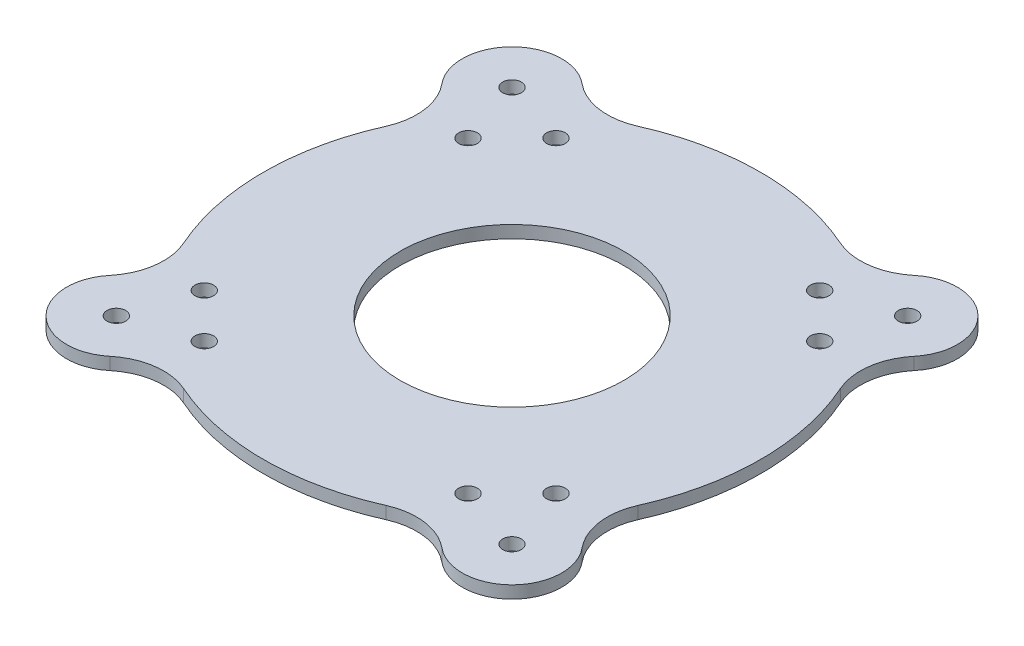
ISO-10303-21;
HEADER;
FILE_DESCRIPTION(('STEP AP214'),'2;1');
FILE_NAME('part.step','',(''),(''),'','','');
FILE_SCHEMA(('AUTOMOTIVE_DESIGN { 1 0 10303 214 1 1 1 1 }'));
ENDSEC;
DATA;
#1=APPLICATION_CONTEXT('core data for automotive mechanical design processes');
#2=APPLICATION_PROTOCOL_DEFINITION('international standard','automotive_design',2000,#1);
#3=PRODUCT_CONTEXT('',#1,'mechanical');
#4=PRODUCT('Part','Part','',(#3));
#5=PRODUCT_RELATED_PRODUCT_CATEGORY('part','',(#4));
#6=PRODUCT_DEFINITION_FORMATION('','',#4);
#7=PRODUCT_DEFINITION_CONTEXT('part definition',#1,'design');
#8=PRODUCT_DEFINITION('design','',#6,#7);
#9=PRODUCT_DEFINITION_SHAPE('','',#8);
#10=(LENGTH_UNIT() NAMED_UNIT(*) SI_UNIT(.MILLI.,.METRE.));
#11=(NAMED_UNIT(*) PLANE_ANGLE_UNIT() SI_UNIT($,.RADIAN.));
#12=(NAMED_UNIT(*) SI_UNIT($,.STERADIAN.) SOLID_ANGLE_UNIT());
#13=UNCERTAINTY_MEASURE_WITH_UNIT(LENGTH_MEASURE(1.E-05),#10,'distance_accuracy_value','');
#14=(GEOMETRIC_REPRESENTATION_CONTEXT(3) GLOBAL_UNCERTAINTY_ASSIGNED_CONTEXT((#13)) GLOBAL_UNIT_ASSIGNED_CONTEXT((#10,
#11,#12)) REPRESENTATION_CONTEXT('',''));
#15=CARTESIAN_POINT('',(0.,0.,0.));
#16=DIRECTION('',(0.,0.,1.));
#17=DIRECTION('',(1.,0.,0.));
#18=AXIS2_PLACEMENT_3D('',#15,#16,#17);
#19=CARTESIAN_POINT('',(0.,2.,0.));
#20=DIRECTION('',(0.,-1.,0.));
#21=DIRECTION('',(0.,0.,-1.));
#22=AXIS2_PLACEMENT_3D('',#19,#20,#21);
#23=CYLINDRICAL_SURFACE('',#22,40.);
#24=CARTESIAN_POINT('',(0.,2.,0.));
#25=DIRECTION('',(0.,1.,0.));
#26=DIRECTION('',(0.,0.,1.));
#27=AXIS2_PLACEMENT_3D('',#24,#25,#26);
#28=CIRCLE('',#27,40.);
#29=CARTESIAN_POINT('',(-36.5429472259402,2.,-16.2669298898764));
#30=VERTEX_POINT('',#29);
#31=CARTESIAN_POINT('',(-36.5429472259399,2.,16.2669298898769));
#32=VERTEX_POINT('',#31);
#33=EDGE_CURVE('E584',#30,#32,#28,.T.);
#34=ORIENTED_EDGE('',*,*,#33,.F.);
#35=DIRECTION('',(0.,-1.,0.));
#36=VECTOR('',#35,1.);
#37=CARTESIAN_POINT('',(-36.5429472259402,2.,-16.2669298898764));
#38=LINE('',#37,#36);
#39=CARTESIAN_POINT('',(-36.5429472259402,0.,-16.2669298898764));
#40=VERTEX_POINT('',#39);
#41=EDGE_CURVE('E189',#30,#40,#38,.T.);
#42=ORIENTED_EDGE('',*,*,#41,.T.);
#43=CARTESIAN_POINT('',(0.,0.,0.));
#44=DIRECTION('',(0.,1.,0.));
#45=DIRECTION('',(0.,0.,1.));
#46=AXIS2_PLACEMENT_3D('',#43,#44,#45);
#47=CIRCLE('',#46,40.);
#48=CARTESIAN_POINT('',(-36.5429472259399,0.,16.2669298898769));
#49=VERTEX_POINT('',#48);
#50=EDGE_CURVE('E172',#40,#49,#47,.T.);
#51=ORIENTED_EDGE('',*,*,#50,.T.);
#52=DIRECTION('',(0.,-1.,0.));
#53=VECTOR('',#52,1.);
#54=CARTESIAN_POINT('',(-36.5429472259399,2.,16.2669298898769));
#55=LINE('',#54,#53);
#56=EDGE_CURVE('E186',#49,#32,#55,.F.);
#57=ORIENTED_EDGE('',*,*,#56,.T.);
#58=EDGE_LOOP('',(#34,#42,#51,#57));
#59=FACE_BOUND('',#58,.T.);
#60=ADVANCED_FACE('F34',(#59),#23,.T.);
#61=CARTESIAN_POINT('',(16.2669298898766,0.,-36.5429472259401));
#62=VERTEX_POINT('',#61);
#63=CARTESIAN_POINT('',(-16.2669298898768,0.,-36.54294722594));
#64=VERTEX_POINT('',#63);
#65=EDGE_CURVE('E158',#62,#64,#47,.T.);
#66=ORIENTED_EDGE('',*,*,#65,.T.);
#67=DIRECTION('',(0.,-1.,0.));
#68=VECTOR('',#67,1.);
#69=CARTESIAN_POINT('',(-16.2669298898768,2.,-36.54294722594));
#70=LINE('',#69,#68);
#71=CARTESIAN_POINT('',(-16.2669298898768,2.,-36.54294722594));
#72=VERTEX_POINT('',#71);
#73=EDGE_CURVE('E162',#64,#72,#70,.F.);
#74=ORIENTED_EDGE('',*,*,#73,.T.);
#75=CARTESIAN_POINT('',(16.2669298898766,2.,-36.5429472259401));
#76=VERTEX_POINT('',#75);
#77=EDGE_CURVE('E161',#76,#72,#28,.T.);
#78=ORIENTED_EDGE('',*,*,#77,.F.);
#79=DIRECTION('',(0.,-1.,0.));
#80=VECTOR('',#79,1.);
#81=CARTESIAN_POINT('',(16.2669298898766,2.,-36.5429472259401));
#82=LINE('',#81,#80);
#83=EDGE_CURVE('E148',#76,#62,#82,.T.);
#84=ORIENTED_EDGE('',*,*,#83,.T.);
#85=EDGE_LOOP('',(#66,#74,#78,#84));
#86=FACE_BOUND('',#85,.T.);
#87=ADVANCED_FACE('F156',(#86),#23,.T.);
#88=CARTESIAN_POINT('',(36.54294722594,2.,16.2669298898767));
#89=VERTEX_POINT('',#88);
#90=CARTESIAN_POINT('',(36.54294722594,2.,-16.2669298898767));
#91=VERTEX_POINT('',#90);
#92=EDGE_CURVE('E163',#89,#91,#28,.T.);
#93=ORIENTED_EDGE('',*,*,#92,.F.);
#94=DIRECTION('',(0.,-1.,0.));
#95=VECTOR('',#94,1.);
#96=CARTESIAN_POINT('',(36.54294722594,2.,16.2669298898767));
#97=LINE('',#96,#95);
#98=CARTESIAN_POINT('',(36.54294722594,0.,16.2669298898767));
#99=VERTEX_POINT('',#98);
#100=EDGE_CURVE('E209',#89,#99,#97,.T.);
#101=ORIENTED_EDGE('',*,*,#100,.T.);
#102=CARTESIAN_POINT('',(36.54294722594,0.,-16.2669298898767));
#103=VERTEX_POINT('',#102);
#104=EDGE_CURVE('E171',#99,#103,#47,.T.);
#105=ORIENTED_EDGE('',*,*,#104,.T.);
#106=DIRECTION('',(0.,-1.,0.));
#107=VECTOR('',#106,1.);
#108=CARTESIAN_POINT('',(36.54294722594,2.,-16.2669298898767));
#109=LINE('',#108,#107);
#110=EDGE_CURVE('E206',#103,#91,#109,.F.);
#111=ORIENTED_EDGE('',*,*,#110,.T.);
#112=EDGE_LOOP('',(#93,#101,#105,#111));
#113=FACE_BOUND('',#112,.T.);
#114=ADVANCED_FACE('F247',(#113),#23,.T.);
#115=CARTESIAN_POINT('',(0.,2.,0.));
#116=DIRECTION('',(0.,1.,0.));
#117=DIRECTION('',(0.,0.,1.));
#118=AXIS2_PLACEMENT_3D('',#115,#116,#117);
#119=PLANE('',#118);
#120=CARTESIAN_POINT('',(31.8198051533948,2.,-31.8198051533945));
#121=DIRECTION('',(0.,1.,0.));
#122=DIRECTION('',(0.,0.,1.));
#123=AXIS2_PLACEMENT_3D('',#120,#121,#122);
#124=CIRCLE('',#123,1.5);
#125=CARTESIAN_POINT('',(31.8198051533948,2.,-30.3198051533945));
#126=VERTEX_POINT('',#125);
#127=EDGE_CURVE('E531',#126,#126,#124,.T.);
#128=ORIENTED_EDGE('',*,*,#127,.F.);
#129=EDGE_LOOP('',(#128));
#130=FACE_BOUND('',#129,.T.);
#131=CARTESIAN_POINT('',(-28.2842712474618,2.,21.2132034355965));
#132=DIRECTION('',(0.,1.,0.));
#133=DIRECTION('',(0.,0.,-1.));
#134=AXIS2_PLACEMENT_3D('',#131,#132,#133);
#135=CIRCLE('',#134,1.5);
#136=CARTESIAN_POINT('',(-28.2842712474618,2.,19.7132034355965));
#137=VERTEX_POINT('',#136);
#138=EDGE_CURVE('E537',#137,#137,#135,.T.);
#139=ORIENTED_EDGE('',*,*,#138,.F.);
#140=EDGE_LOOP('',(#139));
#141=FACE_BOUND('',#140,.T.);
#142=CARTESIAN_POINT('',(21.2132034355965,2.,-28.2842712474618));
#143=DIRECTION('',(0.,1.,0.));
#144=DIRECTION('',(0.,0.,1.));
#145=AXIS2_PLACEMENT_3D('',#142,#143,#144);
#146=CIRCLE('',#145,1.50000000000001);
#147=CARTESIAN_POINT('',(21.2132034355965,2.,-26.7842712474617));
#148=VERTEX_POINT('',#147);
#149=EDGE_CURVE('E639',#148,#148,#146,.T.);
#150=ORIENTED_EDGE('',*,*,#149,.F.);
#151=EDGE_LOOP('',(#150));
#152=FACE_BOUND('',#151,.T.);
#153=CARTESIAN_POINT('',(28.284271247462,2.,-21.2132034355962));
#154=DIRECTION('',(0.,1.,0.));
#155=DIRECTION('',(0.,0.,-1.));
#156=AXIS2_PLACEMENT_3D('',#153,#154,#155);
#157=CIRCLE('',#156,1.5);
#158=CARTESIAN_POINT('',(28.284271247462,2.,-22.7132034355963));
#159=VERTEX_POINT('',#158);
#160=EDGE_CURVE('E644',#159,#159,#157,.T.);
#161=ORIENTED_EDGE('',*,*,#160,.F.);
#162=EDGE_LOOP('',(#161));
#163=FACE_BOUND('',#162,.T.);
#164=CARTESIAN_POINT('',(-21.2132034355963,2.,28.2842712474619));
#165=DIRECTION('',(0.,1.,0.));
#166=DIRECTION('',(0.,0.,1.));
#167=AXIS2_PLACEMENT_3D('',#164,#165,#166);
#168=CIRCLE('',#167,1.50000000000001);
#169=CARTESIAN_POINT('',(-21.2132034355963,2.,29.7842712474619));
#170=VERTEX_POINT('',#169);
#171=EDGE_CURVE('E560',#170,#170,#168,.T.);
#172=ORIENTED_EDGE('',*,*,#171,.F.);
#173=EDGE_LOOP('',(#172));
#174=FACE_BOUND('',#173,.T.);
#175=CARTESIAN_POINT('',(-31.8198051533946,2.,-31.8198051533947));
#176=DIRECTION('',(0.,1.,0.));
#177=DIRECTION('',(0.,0.,1.));
#178=AXIS2_PLACEMENT_3D('',#175,#176,#177);
#179=CIRCLE('',#178,1.5);
#180=CARTESIAN_POINT('',(-31.8198051533946,2.,-30.3198051533947));
#181=VERTEX_POINT('',#180);
#182=EDGE_CURVE('E547',#181,#181,#179,.T.);
#183=ORIENTED_EDGE('',*,*,#182,.F.);
#184=EDGE_LOOP('',(#183));
#185=FACE_BOUND('',#184,.T.);
#186=CARTESIAN_POINT('',(-28.2842712474618,2.,-21.2132034355964));
#187=DIRECTION('',(0.,1.,0.));
#188=DIRECTION('',(0.,0.,1.));
#189=AXIS2_PLACEMENT_3D('',#186,#187,#188);
#190=CIRCLE('',#189,1.50000000000001);
#191=CARTESIAN_POINT('',(-28.2842712474618,2.,-19.7132034355964));
#192=VERTEX_POINT('',#191);
#193=EDGE_CURVE('E548',#192,#192,#190,.T.);
#194=ORIENTED_EDGE('',*,*,#193,.F.);
#195=EDGE_LOOP('',(#194));
#196=FACE_BOUND('',#195,.T.);
#197=CARTESIAN_POINT('',(-21.2132034355964,2.,-28.2842712474619));
#198=DIRECTION('',(0.,1.,0.));
#199=DIRECTION('',(0.,0.,-1.));
#200=AXIS2_PLACEMENT_3D('',#197,#198,#199);
#201=CIRCLE('',#200,1.5);
#202=CARTESIAN_POINT('',(-21.2132034355964,2.,-29.7842712474619));
#203=VERTEX_POINT('',#202);
#204=EDGE_CURVE('E534',#203,#203,#201,.T.);
#205=ORIENTED_EDGE('',*,*,#204,.F.);
#206=EDGE_LOOP('',(#205));
#207=FACE_BOUND('',#206,.T.);
#208=CARTESIAN_POINT('',(31.8198051533944,2.,31.8198051533949));
#209=DIRECTION('',(0.,1.,0.));
#210=DIRECTION('',(0.,0.,1.));
#211=AXIS2_PLACEMENT_3D('',#208,#209,#210);
#212=CIRCLE('',#211,1.5);
#213=CARTESIAN_POINT('',(31.8198051533944,2.,33.3198051533949));
#214=VERTEX_POINT('',#213);
#215=EDGE_CURVE('E622',#214,#214,#212,.T.);
#216=ORIENTED_EDGE('',*,*,#215,.F.);
#217=EDGE_LOOP('',(#216));
#218=FACE_BOUND('',#217,.T.);
#219=CARTESIAN_POINT('',(28.2842712474617,2.,21.2132034355966));
#220=DIRECTION('',(0.,1.,0.));
#221=DIRECTION('',(0.,0.,1.));
#222=AXIS2_PLACEMENT_3D('',#219,#220,#221);
#223=CIRCLE('',#222,1.50000000000001);
#224=CARTESIAN_POINT('',(28.2842712474617,2.,22.7132034355967));
#225=VERTEX_POINT('',#224);
#226=EDGE_CURVE('E626',#225,#225,#223,.T.);
#227=ORIENTED_EDGE('',*,*,#226,.F.);
#228=EDGE_LOOP('',(#227));
#229=FACE_BOUND('',#228,.T.);
#230=CARTESIAN_POINT('',(21.2132034355962,2.,28.2842712474621));
#231=DIRECTION('',(0.,1.,0.));
#232=DIRECTION('',(0.,0.,-1.));
#233=AXIS2_PLACEMENT_3D('',#230,#231,#232);
#234=CIRCLE('',#233,1.5);
#235=CARTESIAN_POINT('',(21.2132034355962,2.,26.7842712474621));
#236=VERTEX_POINT('',#235);
#237=EDGE_CURVE('E629',#236,#236,#234,.T.);
#238=ORIENTED_EDGE('',*,*,#237,.F.);
#239=EDGE_LOOP('',(#238));
#240=FACE_BOUND('',#239,.T.);
#241=CARTESIAN_POINT('',(-31.8198051533946,2.,31.8198051533947));
#242=DIRECTION('',(0.,1.,0.));
#243=DIRECTION('',(0.,0.,1.));
#244=AXIS2_PLACEMENT_3D('',#241,#242,#243);
#245=CIRCLE('',#244,1.5);
#246=CARTESIAN_POINT('',(-31.8198051533946,2.,33.3198051533947));
#247=VERTEX_POINT('',#246);
#248=EDGE_CURVE('E559',#247,#247,#245,.T.);
#249=ORIENTED_EDGE('',*,*,#248,.F.);
#250=EDGE_LOOP('',(#249));
#251=FACE_BOUND('',#250,.T.);
#252=CARTESIAN_POINT('',(-31.8198051533948,2.,-31.8198051533945));
#253=DIRECTION('',(0.,-1.,0.));
#254=DIRECTION('',(0.,0.,-1.));
#255=AXIS2_PLACEMENT_3D('',#252,#253,#254);
#256=CIRCLE('',#255,7.99999999999999);
#257=CARTESIAN_POINT('',(-37.9793068774083,2.,-26.7148528018172));
#258=VERTEX_POINT('',#257);
#259=CARTESIAN_POINT('',(-26.7148528018176,2.,-37.979306877408));
#260=VERTEX_POINT('',#259);
#261=EDGE_CURVE('E257',#258,#260,#256,.T.);
#262=ORIENTED_EDGE('',*,*,#261,.F.);
#263=CARTESIAN_POINT('',(-45.6786840324252,2.,-20.3336623623455));
#264=DIRECTION('',(0.,1.,0.));
#265=DIRECTION('',(0.,0.,1.));
#266=AXIS2_PLACEMENT_3D('',#263,#264,#265);
#267=CIRCLE('',#266,10.);
#268=EDGE_CURVE('E220',#258,#30,#267,.F.);
#269=ORIENTED_EDGE('',*,*,#268,.T.);
#270=ORIENTED_EDGE('',*,*,#33,.T.);
#271=CARTESIAN_POINT('',(-45.6786840324249,2.,20.3336623623462));
#272=DIRECTION('',(0.,1.,0.));
#273=DIRECTION('',(0.,0.,1.));
#274=AXIS2_PLACEMENT_3D('',#271,#272,#273);
#275=CIRCLE('',#274,10.);
#276=CARTESIAN_POINT('',(-37.9793068774079,2.,26.7148528018177));
#277=VERTEX_POINT('',#276);
#278=EDGE_CURVE('E222',#32,#277,#275,.F.);
#279=ORIENTED_EDGE('',*,*,#278,.T.);
#280=CARTESIAN_POINT('',(-31.8198051533944,2.,31.8198051533949));
#281=DIRECTION('',(0.,-1.,0.));
#282=DIRECTION('',(0.,0.,-1.));
#283=AXIS2_PLACEMENT_3D('',#280,#281,#282);
#284=CIRCLE('',#283,7.99999999999999);
#285=CARTESIAN_POINT('',(-26.714852801817,2.,37.9793068774084));
#286=VERTEX_POINT('',#285);
#287=EDGE_CURVE('E574',#286,#277,#284,.T.);
#288=ORIENTED_EDGE('',*,*,#287,.F.);
#289=CARTESIAN_POINT('',(-20.3336623623454,2.,45.6786840324253));
#290=DIRECTION('',(0.,1.,0.));
#291=DIRECTION('',(0.,0.,1.));
#292=AXIS2_PLACEMENT_3D('',#289,#290,#291);
#293=CIRCLE('',#292,10.);
#294=CARTESIAN_POINT('',(-16.2669298898763,2.,36.5429472259402));
#295=VERTEX_POINT('',#294);
#296=EDGE_CURVE('E228',#286,#295,#293,.F.);
#297=ORIENTED_EDGE('',*,*,#296,.T.);
#298=CARTESIAN_POINT('',(16.2669298898766,2.,36.5429472259401));
#299=VERTEX_POINT('',#298);
#300=EDGE_CURVE('E175',#295,#299,#28,.T.);
#301=ORIENTED_EDGE('',*,*,#300,.T.);
#302=CARTESIAN_POINT('',(20.3336623623457,2.,45.6786840324251));
#303=DIRECTION('',(0.,1.,0.));
#304=DIRECTION('',(0.,0.,1.));
#305=AXIS2_PLACEMENT_3D('',#302,#303,#304);
#306=CIRCLE('',#305,10.);
#307=CARTESIAN_POINT('',(26.7148528018173,2.,37.9793068774082));
#308=VERTEX_POINT('',#307);
#309=EDGE_CURVE('E230',#299,#308,#306,.F.);
#310=ORIENTED_EDGE('',*,*,#309,.T.);
#311=CARTESIAN_POINT('',(31.8198051533946,2.,31.8198051533947));
#312=DIRECTION('',(0.,-1.,0.));
#313=DIRECTION('',(0.,0.,-1.));
#314=AXIS2_PLACEMENT_3D('',#311,#312,#313);
#315=CIRCLE('',#314,7.99999999999999);
#316=CARTESIAN_POINT('',(37.9793068774081,2.,26.7148528018174));
#317=VERTEX_POINT('',#316);
#318=EDGE_CURVE('E255',#317,#308,#315,.T.);
#319=ORIENTED_EDGE('',*,*,#318,.F.);
#320=CARTESIAN_POINT('',(45.678684032425,2.,20.3336623623459));
#321=DIRECTION('',(0.,1.,0.));
#322=DIRECTION('',(0.,0.,1.));
#323=AXIS2_PLACEMENT_3D('',#320,#321,#322);
#324=CIRCLE('',#323,10.);
#325=EDGE_CURVE('E236',#317,#89,#324,.F.);
#326=ORIENTED_EDGE('',*,*,#325,.T.);
#327=ORIENTED_EDGE('',*,*,#92,.T.);
#328=CARTESIAN_POINT('',(45.678684032425,2.,-20.3336623623459));
#329=DIRECTION('',(0.,1.,0.));
#330=DIRECTION('',(0.,0.,1.));
#331=AXIS2_PLACEMENT_3D('',#328,#329,#330);
#332=CIRCLE('',#331,10.);
#333=CARTESIAN_POINT('',(37.9793068774081,2.,-26.7148528018174));
#334=VERTEX_POINT('',#333);
#335=EDGE_CURVE('E49',#91,#334,#332,.F.);
#336=ORIENTED_EDGE('',*,*,#335,.T.);
#337=CARTESIAN_POINT('',(31.8198051533946,2.,-31.8198051533947));
#338=DIRECTION('',(0.,-1.,0.));
#339=DIRECTION('',(0.,0.,-1.));
#340=AXIS2_PLACEMENT_3D('',#337,#338,#339);
#341=CIRCLE('',#340,7.99999999999999);
#342=CARTESIAN_POINT('',(26.7148528018173,2.,-37.9793068774082));
#343=VERTEX_POINT('',#342);
#344=EDGE_CURVE('E251',#343,#334,#341,.T.);
#345=ORIENTED_EDGE('',*,*,#344,.F.);
#346=CARTESIAN_POINT('',(20.3336623623457,2.,-45.6786840324251));
#347=DIRECTION('',(0.,1.,0.));
#348=DIRECTION('',(0.,0.,1.));
#349=AXIS2_PLACEMENT_3D('',#346,#347,#348);
#350=CIRCLE('',#349,10.);
#351=EDGE_CURVE('E11',#343,#76,#350,.F.);
#352=ORIENTED_EDGE('',*,*,#351,.T.);
#353=ORIENTED_EDGE('',*,*,#77,.T.);
#354=CARTESIAN_POINT('',(-20.333662362346,2.,-45.678684032425));
#355=DIRECTION('',(0.,1.,0.));
#356=DIRECTION('',(0.,0.,1.));
#357=AXIS2_PLACEMENT_3D('',#354,#355,#356);
#358=CIRCLE('',#357,10.);
#359=EDGE_CURVE('E215',#72,#260,#358,.F.);
#360=ORIENTED_EDGE('',*,*,#359,.T.);
#361=EDGE_LOOP('',(#262,#269,#270,#279,#288,#297,#301,#310,#319,#326,#327,#336,#345,#352,#353,#360));
#362=FACE_BOUND('',#361,.T.);
#363=CARTESIAN_POINT('',(0.,2.,0.));
#364=DIRECTION('',(0.,1.,0.));
#365=DIRECTION('',(0.,0.,1.));
#366=AXIS2_PLACEMENT_3D('',#363,#364,#365);
#367=CIRCLE('',#366,18.);
#368=CARTESIAN_POINT('',(0.,2.,18.));
#369=VERTEX_POINT('',#368);
#370=EDGE_CURVE('E266',#369,#369,#367,.T.);
#371=ORIENTED_EDGE('',*,*,#370,.F.);
#372=EDGE_LOOP('',(#371));
#373=FACE_BOUND('',#372,.T.);
#374=ADVANCED_FACE('F399',(#130,#141,#152,#163,#174,#185,#196,#207,#218,#229,#240,#251,#362,
#373),#119,.T.);
#375=CARTESIAN_POINT('',(0.,0.,0.));
#376=DIRECTION('',(0.,1.,0.));
#377=DIRECTION('',(0.,0.,1.));
#378=AXIS2_PLACEMENT_3D('',#375,#376,#377);
#379=PLANE('',#378);
#380=CARTESIAN_POINT('',(31.8198051533948,0.,-31.8198051533945));
#381=DIRECTION('',(0.,1.,0.));
#382=DIRECTION('',(0.,0.,1.));
#383=AXIS2_PLACEMENT_3D('',#380,#381,#382);
#384=CIRCLE('',#383,1.5);
#385=CARTESIAN_POINT('',(31.8198051533948,0.,-30.3198051533945));
#386=VERTEX_POINT('',#385);
#387=EDGE_CURVE('E528',#386,#386,#384,.T.);
#388=ORIENTED_EDGE('',*,*,#387,.T.);
#389=EDGE_LOOP('',(#388));
#390=FACE_BOUND('',#389,.T.);
#391=CARTESIAN_POINT('',(-28.2842712474618,0.,21.2132034355965));
#392=DIRECTION('',(0.,1.,0.));
#393=DIRECTION('',(0.,0.,-1.));
#394=AXIS2_PLACEMENT_3D('',#391,#392,#393);
#395=CIRCLE('',#394,1.5);
#396=CARTESIAN_POINT('',(-28.2842712474618,0.,19.7132034355965));
#397=VERTEX_POINT('',#396);
#398=EDGE_CURVE('E532',#397,#397,#395,.T.);
#399=ORIENTED_EDGE('',*,*,#398,.T.);
#400=EDGE_LOOP('',(#399));
#401=FACE_BOUND('',#400,.T.);
#402=CARTESIAN_POINT('',(21.2132034355965,0.,-28.2842712474618));
#403=DIRECTION('',(0.,1.,0.));
#404=DIRECTION('',(0.,0.,1.));
#405=AXIS2_PLACEMENT_3D('',#402,#403,#404);
#406=CIRCLE('',#405,1.50000000000001);
#407=CARTESIAN_POINT('',(21.2132034355965,0.,-26.7842712474617));
#408=VERTEX_POINT('',#407);
#409=EDGE_CURVE('E543',#408,#408,#406,.T.);
#410=ORIENTED_EDGE('',*,*,#409,.T.);
#411=EDGE_LOOP('',(#410));
#412=FACE_BOUND('',#411,.T.);
#413=CARTESIAN_POINT('',(28.284271247462,0.,-21.2132034355962));
#414=DIRECTION('',(0.,1.,0.));
#415=DIRECTION('',(0.,0.,-1.));
#416=AXIS2_PLACEMENT_3D('',#413,#414,#415);
#417=CIRCLE('',#416,1.5);
#418=CARTESIAN_POINT('',(28.284271247462,0.,-22.7132034355963));
#419=VERTEX_POINT('',#418);
#420=EDGE_CURVE('E642',#419,#419,#417,.T.);
#421=ORIENTED_EDGE('',*,*,#420,.T.);
#422=EDGE_LOOP('',(#421));
#423=FACE_BOUND('',#422,.T.);
#424=CARTESIAN_POINT('',(-21.2132034355963,0.,28.2842712474619));
#425=DIRECTION('',(0.,1.,0.));
#426=DIRECTION('',(0.,0.,1.));
#427=AXIS2_PLACEMENT_3D('',#424,#425,#426);
#428=CIRCLE('',#427,1.50000000000001);
#429=CARTESIAN_POINT('',(-21.2132034355963,0.,29.7842712474619));
#430=VERTEX_POINT('',#429);
#431=EDGE_CURVE('E556',#430,#430,#428,.T.);
#432=ORIENTED_EDGE('',*,*,#431,.T.);
#433=EDGE_LOOP('',(#432));
#434=FACE_BOUND('',#433,.T.);
#435=CARTESIAN_POINT('',(-31.8198051533946,0.,-31.8198051533947));
#436=DIRECTION('',(0.,1.,0.));
#437=DIRECTION('',(0.,0.,1.));
#438=AXIS2_PLACEMENT_3D('',#435,#436,#437);
#439=CIRCLE('',#438,1.5);
#440=CARTESIAN_POINT('',(-31.8198051533946,0.,-30.3198051533947));
#441=VERTEX_POINT('',#440);
#442=EDGE_CURVE('E563',#441,#441,#439,.T.);
#443=ORIENTED_EDGE('',*,*,#442,.T.);
#444=EDGE_LOOP('',(#443));
#445=FACE_BOUND('',#444,.T.);
#446=CARTESIAN_POINT('',(-28.2842712474618,0.,-21.2132034355964));
#447=DIRECTION('',(0.,1.,0.));
#448=DIRECTION('',(0.,0.,1.));
#449=AXIS2_PLACEMENT_3D('',#446,#447,#448);
#450=CIRCLE('',#449,1.50000000000001);
#451=CARTESIAN_POINT('',(-28.2842712474618,0.,-19.7132034355964));
#452=VERTEX_POINT('',#451);
#453=EDGE_CURVE('E544',#452,#452,#450,.T.);
#454=ORIENTED_EDGE('',*,*,#453,.T.);
#455=EDGE_LOOP('',(#454));
#456=FACE_BOUND('',#455,.T.);
#457=CARTESIAN_POINT('',(-21.2132034355964,0.,-28.2842712474619));
#458=DIRECTION('',(0.,1.,0.));
#459=DIRECTION('',(0.,0.,-1.));
#460=AXIS2_PLACEMENT_3D('',#457,#458,#459);
#461=CIRCLE('',#460,1.5);
#462=CARTESIAN_POINT('',(-21.2132034355964,0.,-29.7842712474619));
#463=VERTEX_POINT('',#462);
#464=EDGE_CURVE('E551',#463,#463,#461,.T.);
#465=ORIENTED_EDGE('',*,*,#464,.T.);
#466=EDGE_LOOP('',(#465));
#467=FACE_BOUND('',#466,.T.);
#468=CARTESIAN_POINT('',(31.8198051533944,0.,31.8198051533949));
#469=DIRECTION('',(0.,1.,0.));
#470=DIRECTION('',(0.,0.,1.));
#471=AXIS2_PLACEMENT_3D('',#468,#469,#470);
#472=CIRCLE('',#471,1.5);
#473=CARTESIAN_POINT('',(31.8198051533944,0.,33.3198051533949));
#474=VERTEX_POINT('',#473);
#475=EDGE_CURVE('E646',#474,#474,#472,.T.);
#476=ORIENTED_EDGE('',*,*,#475,.T.);
#477=EDGE_LOOP('',(#476));
#478=FACE_BOUND('',#477,.T.);
#479=CARTESIAN_POINT('',(28.2842712474617,0.,21.2132034355966));
#480=DIRECTION('',(0.,1.,0.));
#481=DIRECTION('',(0.,0.,1.));
#482=AXIS2_PLACEMENT_3D('',#479,#480,#481);
#483=CIRCLE('',#482,1.50000000000001);
#484=CARTESIAN_POINT('',(28.2842712474617,0.,22.7132034355967));
#485=VERTEX_POINT('',#484);
#486=EDGE_CURVE('E653',#485,#485,#483,.T.);
#487=ORIENTED_EDGE('',*,*,#486,.T.);
#488=EDGE_LOOP('',(#487));
#489=FACE_BOUND('',#488,.T.);
#490=CARTESIAN_POINT('',(21.2132034355962,0.,28.2842712474621));
#491=DIRECTION('',(0.,1.,0.));
#492=DIRECTION('',(0.,0.,-1.));
#493=AXIS2_PLACEMENT_3D('',#490,#491,#492);
#494=CIRCLE('',#493,1.5);
#495=CARTESIAN_POINT('',(21.2132034355962,0.,26.7842712474621));
#496=VERTEX_POINT('',#495);
#497=EDGE_CURVE('E631',#496,#496,#494,.T.);
#498=ORIENTED_EDGE('',*,*,#497,.T.);
#499=EDGE_LOOP('',(#498));
#500=FACE_BOUND('',#499,.T.);
#501=CARTESIAN_POINT('',(-31.8198051533946,0.,31.8198051533947));
#502=DIRECTION('',(0.,1.,0.));
#503=DIRECTION('',(0.,0.,1.));
#504=AXIS2_PLACEMENT_3D('',#501,#502,#503);
#505=CIRCLE('',#504,1.5);
#506=CARTESIAN_POINT('',(-31.8198051533946,0.,33.3198051533947));
#507=VERTEX_POINT('',#506);
#508=EDGE_CURVE('E568',#507,#507,#505,.T.);
#509=ORIENTED_EDGE('',*,*,#508,.T.);
#510=EDGE_LOOP('',(#509));
#511=FACE_BOUND('',#510,.T.);
#512=CARTESIAN_POINT('',(-31.8198051533944,0.,31.8198051533949));
#513=DIRECTION('',(0.,-1.,0.));
#514=DIRECTION('',(0.,0.,-1.));
#515=AXIS2_PLACEMENT_3D('',#512,#513,#514);
#516=CIRCLE('',#515,7.99999999999999);
#517=CARTESIAN_POINT('',(-26.714852801817,0.,37.9793068774084));
#518=VERTEX_POINT('',#517);
#519=CARTESIAN_POINT('',(-37.9793068774079,0.,26.7148528018177));
#520=VERTEX_POINT('',#519);
#521=EDGE_CURVE('E571',#518,#520,#516,.T.);
#522=ORIENTED_EDGE('',*,*,#521,.T.);
#523=CARTESIAN_POINT('',(-45.6786840324249,0.,20.3336623623462));
#524=DIRECTION('',(0.,1.,0.));
#525=DIRECTION('',(0.,0.,1.));
#526=AXIS2_PLACEMENT_3D('',#523,#524,#525);
#527=CIRCLE('',#526,10.);
#528=EDGE_CURVE('E224',#520,#49,#527,.T.);
#529=ORIENTED_EDGE('',*,*,#528,.T.);
#530=ORIENTED_EDGE('',*,*,#50,.F.);
#531=CARTESIAN_POINT('',(-45.6786840324252,0.,-20.3336623623455));
#532=DIRECTION('',(0.,1.,0.));
#533=DIRECTION('',(0.,0.,1.));
#534=AXIS2_PLACEMENT_3D('',#531,#532,#533);
#535=CIRCLE('',#534,10.);
#536=CARTESIAN_POINT('',(-37.9793068774083,0.,-26.7148528018172));
#537=VERTEX_POINT('',#536);
#538=EDGE_CURVE('E218',#40,#537,#535,.T.);
#539=ORIENTED_EDGE('',*,*,#538,.T.);
#540=CARTESIAN_POINT('',(-31.8198051533948,0.,-31.8198051533945));
#541=DIRECTION('',(0.,-1.,0.));
#542=DIRECTION('',(0.,0.,-1.));
#543=AXIS2_PLACEMENT_3D('',#540,#541,#542);
#544=CIRCLE('',#543,7.99999999999999);
#545=CARTESIAN_POINT('',(-26.7148528018176,0.,-37.979306877408));
#546=VERTEX_POINT('',#545);
#547=EDGE_CURVE('E260',#537,#546,#544,.T.);
#548=ORIENTED_EDGE('',*,*,#547,.T.);
#549=CARTESIAN_POINT('',(-20.333662362346,0.,-45.678684032425));
#550=DIRECTION('',(0.,1.,0.));
#551=DIRECTION('',(0.,0.,1.));
#552=AXIS2_PLACEMENT_3D('',#549,#550,#551);
#553=CIRCLE('',#552,10.);
#554=EDGE_CURVE('E170',#546,#64,#553,.T.);
#555=ORIENTED_EDGE('',*,*,#554,.T.);
#556=ORIENTED_EDGE('',*,*,#65,.F.);
#557=CARTESIAN_POINT('',(20.3336623623457,0.,-45.6786840324251));
#558=DIRECTION('',(0.,1.,0.));
#559=DIRECTION('',(0.,0.,1.));
#560=AXIS2_PLACEMENT_3D('',#557,#558,#559);
#561=CIRCLE('',#560,10.);
#562=CARTESIAN_POINT('',(26.7148528018173,0.,-37.9793068774082));
#563=VERTEX_POINT('',#562);
#564=EDGE_CURVE('E42',#62,#563,#561,.T.);
#565=ORIENTED_EDGE('',*,*,#564,.T.);
#566=CARTESIAN_POINT('',(31.8198051533946,0.,-31.8198051533947));
#567=DIRECTION('',(0.,-1.,0.));
#568=DIRECTION('',(0.,0.,-1.));
#569=AXIS2_PLACEMENT_3D('',#566,#567,#568);
#570=CIRCLE('',#569,7.99999999999999);
#571=CARTESIAN_POINT('',(37.9793068774081,0.,-26.7148528018174));
#572=VERTEX_POINT('',#571);
#573=EDGE_CURVE('E241',#563,#572,#570,.T.);
#574=ORIENTED_EDGE('',*,*,#573,.T.);
#575=CARTESIAN_POINT('',(45.678684032425,0.,-20.3336623623459));
#576=DIRECTION('',(0.,1.,0.));
#577=DIRECTION('',(0.,0.,1.));
#578=AXIS2_PLACEMENT_3D('',#575,#576,#577);
#579=CIRCLE('',#578,10.);
#580=EDGE_CURVE('E152',#572,#103,#579,.T.);
#581=ORIENTED_EDGE('',*,*,#580,.T.);
#582=ORIENTED_EDGE('',*,*,#104,.F.);
#583=CARTESIAN_POINT('',(45.678684032425,0.,20.3336623623459));
#584=DIRECTION('',(0.,1.,0.));
#585=DIRECTION('',(0.,0.,1.));
#586=AXIS2_PLACEMENT_3D('',#583,#584,#585);
#587=CIRCLE('',#586,10.);
#588=CARTESIAN_POINT('',(37.9793068774081,0.,26.7148528018174));
#589=VERTEX_POINT('',#588);
#590=EDGE_CURVE('E234',#99,#589,#587,.T.);
#591=ORIENTED_EDGE('',*,*,#590,.T.);
#592=CARTESIAN_POINT('',(31.8198051533946,0.,31.8198051533947));
#593=DIRECTION('',(0.,-1.,0.));
#594=DIRECTION('',(0.,0.,-1.));
#595=AXIS2_PLACEMENT_3D('',#592,#593,#594);
#596=CIRCLE('',#595,7.99999999999999);
#597=CARTESIAN_POINT('',(26.7148528018173,0.,37.9793068774082));
#598=VERTEX_POINT('',#597);
#599=EDGE_CURVE('E252',#589,#598,#596,.T.);
#600=ORIENTED_EDGE('',*,*,#599,.T.);
#601=CARTESIAN_POINT('',(20.3336623623457,0.,45.6786840324251));
#602=DIRECTION('',(0.,1.,0.));
#603=DIRECTION('',(0.,0.,1.));
#604=AXIS2_PLACEMENT_3D('',#601,#602,#603);
#605=CIRCLE('',#604,10.);
#606=CARTESIAN_POINT('',(16.2669298898766,0.,36.5429472259401));
#607=VERTEX_POINT('',#606);
#608=EDGE_CURVE('E232',#598,#607,#605,.T.);
#609=ORIENTED_EDGE('',*,*,#608,.T.);
#610=CARTESIAN_POINT('',(-16.2669298898763,0.,36.5429472259402));
#611=VERTEX_POINT('',#610);
#612=EDGE_CURVE('E176',#611,#607,#47,.T.);
#613=ORIENTED_EDGE('',*,*,#612,.F.);
#614=CARTESIAN_POINT('',(-20.3336623623454,0.,45.6786840324253));
#615=DIRECTION('',(0.,1.,0.));
#616=DIRECTION('',(0.,0.,1.));
#617=AXIS2_PLACEMENT_3D('',#614,#615,#616);
#618=CIRCLE('',#617,10.);
#619=EDGE_CURVE('E226',#611,#518,#618,.T.);
#620=ORIENTED_EDGE('',*,*,#619,.T.);
#621=EDGE_LOOP('',(#522,#529,#530,#539,#548,#555,#556,#565,#574,#581,#582,#591,#600,#609,#613,#620));
#622=FACE_BOUND('',#621,.T.);
#623=CARTESIAN_POINT('',(0.,0.,0.));
#624=DIRECTION('',(0.,1.,0.));
#625=DIRECTION('',(0.,0.,1.));
#626=AXIS2_PLACEMENT_3D('',#623,#624,#625);
#627=CIRCLE('',#626,18.);
#628=CARTESIAN_POINT('',(0.,0.,18.));
#629=VERTEX_POINT('',#628);
#630=EDGE_CURVE('E264',#629,#629,#627,.T.);
#631=ORIENTED_EDGE('',*,*,#630,.T.);
#632=EDGE_LOOP('',(#631));
#633=FACE_BOUND('',#632,.T.);
#634=ADVANCED_FACE('F166',(#390,#401,#412,#423,#434,#445,#456,#467,#478,#489,#500,#511,#622,
#633),#379,.F.);
#635=ORIENTED_EDGE('',*,*,#300,.F.);
#636=DIRECTION('',(0.,-1.,0.));
#637=VECTOR('',#636,1.);
#638=CARTESIAN_POINT('',(-16.2669298898763,2.,36.5429472259402));
#639=LINE('',#638,#637);
#640=EDGE_CURVE('E199',#295,#611,#639,.T.);
#641=ORIENTED_EDGE('',*,*,#640,.T.);
#642=ORIENTED_EDGE('',*,*,#612,.T.);
#643=DIRECTION('',(0.,-1.,0.));
#644=VECTOR('',#643,1.);
#645=CARTESIAN_POINT('',(16.2669298898766,2.,36.5429472259401));
#646=LINE('',#645,#644);
#647=EDGE_CURVE('E196',#607,#299,#646,.F.);
#648=ORIENTED_EDGE('',*,*,#647,.T.);
#649=EDGE_LOOP('',(#635,#641,#642,#648));
#650=FACE_BOUND('',#649,.T.);
#651=ADVANCED_FACE('F274',(#650),#23,.T.);
#652=CARTESIAN_POINT('',(0.,2.,0.));
#653=DIRECTION('',(0.,-1.,0.));
#654=DIRECTION('',(0.,0.,-1.));
#655=AXIS2_PLACEMENT_3D('',#652,#653,#654);
#656=CYLINDRICAL_SURFACE('',#655,18.);
#657=ORIENTED_EDGE('',*,*,#370,.T.);
#658=EDGE_LOOP('',(#657));
#659=FACE_BOUND('',#658,.T.);
#660=ORIENTED_EDGE('',*,*,#630,.F.);
#661=EDGE_LOOP('',(#660));
#662=FACE_BOUND('',#661,.T.);
#663=ADVANCED_FACE('F271',(#659,#662),#656,.F.);
#664=CARTESIAN_POINT('',(31.8198051533946,2.,31.8198051533947));
#665=DIRECTION('',(0.,-1.,0.));
#666=DIRECTION('',(0.,0.,-1.));
#667=AXIS2_PLACEMENT_3D('',#664,#665,#666);
#668=CYLINDRICAL_SURFACE('',#667,7.99999999999999);
#669=ORIENTED_EDGE('',*,*,#318,.T.);
#670=DIRECTION('',(0.,-1.,0.));
#671=VECTOR('',#670,1.);
#672=CARTESIAN_POINT('',(26.7148528018173,2.,37.9793068774082));
#673=LINE('',#672,#671);
#674=EDGE_CURVE('E204',#308,#598,#673,.T.);
#675=ORIENTED_EDGE('',*,*,#674,.T.);
#676=ORIENTED_EDGE('',*,*,#599,.F.);
#677=DIRECTION('',(0.,-1.,0.));
#678=VECTOR('',#677,1.);
#679=CARTESIAN_POINT('',(37.9793068774081,2.,26.7148528018174));
#680=LINE('',#679,#678);
#681=EDGE_CURVE('E202',#589,#317,#680,.F.);
#682=ORIENTED_EDGE('',*,*,#681,.T.);
#683=EDGE_LOOP('',(#669,#675,#676,#682));
#684=FACE_BOUND('',#683,.T.);
#685=ADVANCED_FACE('F273',(#684),#668,.T.);
#686=CARTESIAN_POINT('',(31.8198051533946,2.,-31.8198051533947));
#687=DIRECTION('',(0.,-1.,0.));
#688=DIRECTION('',(0.,0.,-1.));
#689=AXIS2_PLACEMENT_3D('',#686,#687,#688);
#690=CYLINDRICAL_SURFACE('',#689,7.99999999999999);
#691=ORIENTED_EDGE('',*,*,#344,.T.);
#692=DIRECTION('',(0.,-1.,0.));
#693=VECTOR('',#692,1.);
#694=CARTESIAN_POINT('',(37.9793068774081,2.,-26.7148528018174));
#695=LINE('',#694,#693);
#696=EDGE_CURVE('E213',#334,#572,#695,.T.);
#697=ORIENTED_EDGE('',*,*,#696,.T.);
#698=ORIENTED_EDGE('',*,*,#573,.F.);
#699=DIRECTION('',(0.,-1.,0.));
#700=VECTOR('',#699,1.);
#701=CARTESIAN_POINT('',(26.7148528018173,2.,-37.9793068774082));
#702=LINE('',#701,#700);
#703=EDGE_CURVE('E56',#563,#343,#702,.F.);
#704=ORIENTED_EDGE('',*,*,#703,.T.);
#705=EDGE_LOOP('',(#691,#697,#698,#704));
#706=FACE_BOUND('',#705,.T.);
#707=ADVANCED_FACE('F250',(#706),#690,.T.);
#708=CARTESIAN_POINT('',(-31.8198051533948,2.,-31.8198051533945));
#709=DIRECTION('',(0.,-1.,0.));
#710=DIRECTION('',(0.,0.,-1.));
#711=AXIS2_PLACEMENT_3D('',#708,#709,#710);
#712=CYLINDRICAL_SURFACE('',#711,7.99999999999999);
#713=ORIENTED_EDGE('',*,*,#261,.T.);
#714=DIRECTION('',(0.,-1.,0.));
#715=VECTOR('',#714,1.);
#716=CARTESIAN_POINT('',(-26.7148528018176,2.,-37.979306877408));
#717=LINE('',#716,#715);
#718=EDGE_CURVE('E184',#260,#546,#717,.T.);
#719=ORIENTED_EDGE('',*,*,#718,.T.);
#720=ORIENTED_EDGE('',*,*,#547,.F.);
#721=DIRECTION('',(0.,-1.,0.));
#722=VECTOR('',#721,1.);
#723=CARTESIAN_POINT('',(-37.9793068774083,2.,-26.7148528018172));
#724=LINE('',#723,#722);
#725=EDGE_CURVE('E182',#537,#258,#724,.F.);
#726=ORIENTED_EDGE('',*,*,#725,.T.);
#727=EDGE_LOOP('',(#713,#719,#720,#726));
#728=FACE_BOUND('',#727,.T.);
#729=ADVANCED_FACE('F343',(#728),#712,.T.);
#730=CARTESIAN_POINT('',(-31.8198051533944,2.,31.8198051533949));
#731=DIRECTION('',(0.,-1.,0.));
#732=DIRECTION('',(0.,0.,-1.));
#733=AXIS2_PLACEMENT_3D('',#730,#731,#732);
#734=CYLINDRICAL_SURFACE('',#733,7.99999999999999);
#735=ORIENTED_EDGE('',*,*,#287,.T.);
#736=DIRECTION('',(0.,-1.,0.));
#737=VECTOR('',#736,1.);
#738=CARTESIAN_POINT('',(-37.9793068774079,2.,26.7148528018177));
#739=LINE('',#738,#737);
#740=EDGE_CURVE('E194',#277,#520,#739,.T.);
#741=ORIENTED_EDGE('',*,*,#740,.T.);
#742=ORIENTED_EDGE('',*,*,#521,.F.);
#743=DIRECTION('',(0.,-1.,0.));
#744=VECTOR('',#743,1.);
#745=CARTESIAN_POINT('',(-26.714852801817,2.,37.9793068774084));
#746=LINE('',#745,#744);
#747=EDGE_CURVE('E192',#518,#286,#746,.F.);
#748=ORIENTED_EDGE('',*,*,#747,.T.);
#749=EDGE_LOOP('',(#735,#741,#742,#748));
#750=FACE_BOUND('',#749,.T.);
#751=ADVANCED_FACE('F298',(#750),#734,.T.);
#752=CARTESIAN_POINT('',(-20.333662362346,2.,-45.678684032425));
#753=DIRECTION('',(0.,-1.,0.));
#754=DIRECTION('',(0.,0.,-1.));
#755=AXIS2_PLACEMENT_3D('',#752,#753,#754);
#756=CYLINDRICAL_SURFACE('',#755,10.);
#757=ORIENTED_EDGE('',*,*,#554,.F.);
#758=ORIENTED_EDGE('',*,*,#718,.F.);
#759=ORIENTED_EDGE('',*,*,#359,.F.);
#760=ORIENTED_EDGE('',*,*,#73,.F.);
#761=EDGE_LOOP('',(#757,#758,#759,#760));
#762=FACE_BOUND('',#761,.T.);
#763=ADVANCED_FACE('F294',(#762),#756,.F.);
#764=CARTESIAN_POINT('',(-45.6786840324252,2.,-20.3336623623455));
#765=DIRECTION('',(0.,1.,0.));
#766=DIRECTION('',(0.,0.,1.));
#767=AXIS2_PLACEMENT_3D('',#764,#765,#766);
#768=CYLINDRICAL_SURFACE('',#767,10.);
#769=ORIENTED_EDGE('',*,*,#268,.F.);
#770=ORIENTED_EDGE('',*,*,#725,.F.);
#771=ORIENTED_EDGE('',*,*,#538,.F.);
#772=ORIENTED_EDGE('',*,*,#41,.F.);
#773=EDGE_LOOP('',(#769,#770,#771,#772));
#774=FACE_BOUND('',#773,.T.);
#775=ADVANCED_FACE('F297',(#774),#768,.F.);
#776=CARTESIAN_POINT('',(-45.6786840324249,2.,20.3336623623462));
#777=DIRECTION('',(0.,-1.,0.));
#778=DIRECTION('',(0.,0.,-1.));
#779=AXIS2_PLACEMENT_3D('',#776,#777,#778);
#780=CYLINDRICAL_SURFACE('',#779,10.);
#781=ORIENTED_EDGE('',*,*,#528,.F.);
#782=ORIENTED_EDGE('',*,*,#740,.F.);
#783=ORIENTED_EDGE('',*,*,#278,.F.);
#784=ORIENTED_EDGE('',*,*,#56,.F.);
#785=EDGE_LOOP('',(#781,#782,#783,#784));
#786=FACE_BOUND('',#785,.T.);
#787=ADVANCED_FACE('F302',(#786),#780,.F.);
#788=CARTESIAN_POINT('',(-20.3336623623454,2.,45.6786840324253));
#789=DIRECTION('',(0.,1.,0.));
#790=DIRECTION('',(0.,0.,1.));
#791=AXIS2_PLACEMENT_3D('',#788,#789,#790);
#792=CYLINDRICAL_SURFACE('',#791,10.);
#793=ORIENTED_EDGE('',*,*,#296,.F.);
#794=ORIENTED_EDGE('',*,*,#747,.F.);
#795=ORIENTED_EDGE('',*,*,#619,.F.);
#796=ORIENTED_EDGE('',*,*,#640,.F.);
#797=EDGE_LOOP('',(#793,#794,#795,#796));
#798=FACE_BOUND('',#797,.T.);
#799=ADVANCED_FACE('F306',(#798),#792,.F.);
#800=CARTESIAN_POINT('',(20.3336623623457,2.,45.6786840324251));
#801=DIRECTION('',(0.,-1.,0.));
#802=DIRECTION('',(0.,0.,-1.));
#803=AXIS2_PLACEMENT_3D('',#800,#801,#802);
#804=CYLINDRICAL_SURFACE('',#803,10.);
#805=ORIENTED_EDGE('',*,*,#608,.F.);
#806=ORIENTED_EDGE('',*,*,#674,.F.);
#807=ORIENTED_EDGE('',*,*,#309,.F.);
#808=ORIENTED_EDGE('',*,*,#647,.F.);
#809=EDGE_LOOP('',(#805,#806,#807,#808));
#810=FACE_BOUND('',#809,.T.);
#811=ADVANCED_FACE('F310',(#810),#804,.F.);
#812=CARTESIAN_POINT('',(45.678684032425,2.,20.3336623623459));
#813=DIRECTION('',(0.,1.,0.));
#814=DIRECTION('',(0.,0.,1.));
#815=AXIS2_PLACEMENT_3D('',#812,#813,#814);
#816=CYLINDRICAL_SURFACE('',#815,10.);
#817=ORIENTED_EDGE('',*,*,#325,.F.);
#818=ORIENTED_EDGE('',*,*,#681,.F.);
#819=ORIENTED_EDGE('',*,*,#590,.F.);
#820=ORIENTED_EDGE('',*,*,#100,.F.);
#821=EDGE_LOOP('',(#817,#818,#819,#820));
#822=FACE_BOUND('',#821,.T.);
#823=ADVANCED_FACE('F314',(#822),#816,.F.);
#824=CARTESIAN_POINT('',(45.678684032425,2.,-20.3336623623459));
#825=DIRECTION('',(0.,-1.,0.));
#826=DIRECTION('',(0.,0.,-1.));
#827=AXIS2_PLACEMENT_3D('',#824,#825,#826);
#828=CYLINDRICAL_SURFACE('',#827,10.);
#829=ORIENTED_EDGE('',*,*,#580,.F.);
#830=ORIENTED_EDGE('',*,*,#696,.F.);
#831=ORIENTED_EDGE('',*,*,#335,.F.);
#832=ORIENTED_EDGE('',*,*,#110,.F.);
#833=EDGE_LOOP('',(#829,#830,#831,#832));
#834=FACE_BOUND('',#833,.T.);
#835=ADVANCED_FACE('F249',(#834),#828,.F.);
#836=CARTESIAN_POINT('',(20.3336623623457,2.,-45.6786840324251));
#837=DIRECTION('',(0.,1.,0.));
#838=DIRECTION('',(0.,0.,1.));
#839=AXIS2_PLACEMENT_3D('',#836,#837,#838);
#840=CYLINDRICAL_SURFACE('',#839,10.);
#841=ORIENTED_EDGE('',*,*,#351,.F.);
#842=ORIENTED_EDGE('',*,*,#703,.F.);
#843=ORIENTED_EDGE('',*,*,#564,.F.);
#844=ORIENTED_EDGE('',*,*,#83,.F.);
#845=EDGE_LOOP('',(#841,#842,#843,#844));
#846=FACE_BOUND('',#845,.T.);
#847=ADVANCED_FACE('F36',(#846),#840,.F.);
#848=CARTESIAN_POINT('',(-31.8198051533946,0.,31.8198051533947));
#849=DIRECTION('',(0.,1.,0.));
#850=DIRECTION('',(0.,0.,1.));
#851=AXIS2_PLACEMENT_3D('',#848,#849,#850);
#852=CYLINDRICAL_SURFACE('',#851,1.5);
#853=ORIENTED_EDGE('',*,*,#508,.F.);
#854=EDGE_LOOP('',(#853));
#855=FACE_BOUND('',#854,.T.);
#856=ORIENTED_EDGE('',*,*,#248,.T.);
#857=EDGE_LOOP('',(#856));
#858=FACE_BOUND('',#857,.T.);
#859=ADVANCED_FACE('F322',(#855,#858),#852,.F.);
#860=CARTESIAN_POINT('',(21.2132034355962,0.,28.2842712474621));
#861=DIRECTION('',(0.,1.,0.));
#862=DIRECTION('',(0.,0.,1.));
#863=AXIS2_PLACEMENT_3D('',#860,#861,#862);
#864=CYLINDRICAL_SURFACE('',#863,1.5);
#865=ORIENTED_EDGE('',*,*,#497,.F.);
#866=EDGE_LOOP('',(#865));
#867=FACE_BOUND('',#866,.T.);
#868=ORIENTED_EDGE('',*,*,#237,.T.);
#869=EDGE_LOOP('',(#868));
#870=FACE_BOUND('',#869,.T.);
#871=ADVANCED_FACE('F326',(#867,#870),#864,.F.);
#872=CARTESIAN_POINT('',(28.2842712474617,0.,21.2132034355966));
#873=DIRECTION('',(0.,1.,0.));
#874=DIRECTION('',(0.,0.,1.));
#875=AXIS2_PLACEMENT_3D('',#872,#873,#874);
#876=CYLINDRICAL_SURFACE('',#875,1.50000000000001);
#877=ORIENTED_EDGE('',*,*,#486,.F.);
#878=EDGE_LOOP('',(#877));
#879=FACE_BOUND('',#878,.T.);
#880=ORIENTED_EDGE('',*,*,#226,.T.);
#881=EDGE_LOOP('',(#880));
#882=FACE_BOUND('',#881,.T.);
#883=ADVANCED_FACE('F332',(#879,#882),#876,.F.);
#884=CARTESIAN_POINT('',(31.8198051533944,0.,31.8198051533949));
#885=DIRECTION('',(0.,1.,0.));
#886=DIRECTION('',(0.,0.,1.));
#887=AXIS2_PLACEMENT_3D('',#884,#885,#886);
#888=CYLINDRICAL_SURFACE('',#887,1.5);
#889=ORIENTED_EDGE('',*,*,#475,.F.);
#890=EDGE_LOOP('',(#889));
#891=FACE_BOUND('',#890,.T.);
#892=ORIENTED_EDGE('',*,*,#215,.T.);
#893=EDGE_LOOP('',(#892));
#894=FACE_BOUND('',#893,.T.);
#895=ADVANCED_FACE('F434',(#891,#894),#888,.F.);
#896=CARTESIAN_POINT('',(-21.2132034355964,0.,-28.2842712474619));
#897=DIRECTION('',(0.,1.,0.));
#898=DIRECTION('',(0.,0.,1.));
#899=AXIS2_PLACEMENT_3D('',#896,#897,#898);
#900=CYLINDRICAL_SURFACE('',#899,1.5);
#901=ORIENTED_EDGE('',*,*,#464,.F.);
#902=EDGE_LOOP('',(#901));
#903=FACE_BOUND('',#902,.T.);
#904=ORIENTED_EDGE('',*,*,#204,.T.);
#905=EDGE_LOOP('',(#904));
#906=FACE_BOUND('',#905,.T.);
#907=ADVANCED_FACE('F444',(#903,#906),#900,.F.);
#908=CARTESIAN_POINT('',(-28.2842712474618,0.,-21.2132034355964));
#909=DIRECTION('',(0.,1.,0.));
#910=DIRECTION('',(0.,0.,1.));
#911=AXIS2_PLACEMENT_3D('',#908,#909,#910);
#912=CYLINDRICAL_SURFACE('',#911,1.50000000000001);
#913=ORIENTED_EDGE('',*,*,#453,.F.);
#914=EDGE_LOOP('',(#913));
#915=FACE_BOUND('',#914,.T.);
#916=ORIENTED_EDGE('',*,*,#193,.T.);
#917=EDGE_LOOP('',(#916));
#918=FACE_BOUND('',#917,.T.);
#919=ADVANCED_FACE('F454',(#915,#918),#912,.F.);
#920=CARTESIAN_POINT('',(-31.8198051533946,0.,-31.8198051533947));
#921=DIRECTION('',(0.,1.,0.));
#922=DIRECTION('',(0.,0.,1.));
#923=AXIS2_PLACEMENT_3D('',#920,#921,#922);
#924=CYLINDRICAL_SURFACE('',#923,1.5);
#925=ORIENTED_EDGE('',*,*,#442,.F.);
#926=EDGE_LOOP('',(#925));
#927=FACE_BOUND('',#926,.T.);
#928=ORIENTED_EDGE('',*,*,#182,.T.);
#929=EDGE_LOOP('',(#928));
#930=FACE_BOUND('',#929,.T.);
#931=ADVANCED_FACE('F339',(#927,#930),#924,.F.);
#932=CARTESIAN_POINT('',(-21.2132034355963,0.,28.2842712474619));
#933=DIRECTION('',(0.,1.,0.));
#934=DIRECTION('',(0.,0.,1.));
#935=AXIS2_PLACEMENT_3D('',#932,#933,#934);
#936=CYLINDRICAL_SURFACE('',#935,1.50000000000001);
#937=ORIENTED_EDGE('',*,*,#431,.F.);
#938=EDGE_LOOP('',(#937));
#939=FACE_BOUND('',#938,.T.);
#940=ORIENTED_EDGE('',*,*,#171,.T.);
#941=EDGE_LOOP('',(#940));
#942=FACE_BOUND('',#941,.T.);
#943=ADVANCED_FACE('F473',(#939,#942),#936,.F.);
#944=CARTESIAN_POINT('',(28.284271247462,0.,-21.2132034355962));
#945=DIRECTION('',(0.,1.,0.));
#946=DIRECTION('',(0.,0.,1.));
#947=AXIS2_PLACEMENT_3D('',#944,#945,#946);
#948=CYLINDRICAL_SURFACE('',#947,1.5);
#949=ORIENTED_EDGE('',*,*,#420,.F.);
#950=EDGE_LOOP('',(#949));
#951=FACE_BOUND('',#950,.T.);
#952=ORIENTED_EDGE('',*,*,#160,.T.);
#953=EDGE_LOOP('',(#952));
#954=FACE_BOUND('',#953,.T.);
#955=ADVANCED_FACE('F482',(#951,#954),#948,.F.);
#956=CARTESIAN_POINT('',(21.2132034355965,0.,-28.2842712474618));
#957=DIRECTION('',(0.,1.,0.));
#958=DIRECTION('',(0.,0.,1.));
#959=AXIS2_PLACEMENT_3D('',#956,#957,#958);
#960=CYLINDRICAL_SURFACE('',#959,1.50000000000001);
#961=ORIENTED_EDGE('',*,*,#409,.F.);
#962=EDGE_LOOP('',(#961));
#963=FACE_BOUND('',#962,.T.);
#964=ORIENTED_EDGE('',*,*,#149,.T.);
#965=EDGE_LOOP('',(#964));
#966=FACE_BOUND('',#965,.T.);
#967=ADVANCED_FACE('F491',(#963,#966),#960,.F.);
#968=CARTESIAN_POINT('',(-28.2842712474618,0.,21.2132034355965));
#969=DIRECTION('',(0.,1.,0.));
#970=DIRECTION('',(0.,0.,1.));
#971=AXIS2_PLACEMENT_3D('',#968,#969,#970);
#972=CYLINDRICAL_SURFACE('',#971,1.5);
#973=ORIENTED_EDGE('',*,*,#398,.F.);
#974=EDGE_LOOP('',(#973));
#975=FACE_BOUND('',#974,.T.);
#976=ORIENTED_EDGE('',*,*,#138,.T.);
#977=EDGE_LOOP('',(#976));
#978=FACE_BOUND('',#977,.T.);
#979=ADVANCED_FACE('F501',(#975,#978),#972,.F.);
#980=CARTESIAN_POINT('',(31.8198051533948,0.,-31.8198051533945));
#981=DIRECTION('',(0.,1.,0.));
#982=DIRECTION('',(0.,0.,1.));
#983=AXIS2_PLACEMENT_3D('',#980,#981,#982);
#984=CYLINDRICAL_SURFACE('',#983,1.5);
#985=ORIENTED_EDGE('',*,*,#387,.F.);
#986=EDGE_LOOP('',(#985));
#987=FACE_BOUND('',#986,.T.);
#988=ORIENTED_EDGE('',*,*,#127,.T.);
#989=EDGE_LOOP('',(#988));
#990=FACE_BOUND('',#989,.T.);
#991=ADVANCED_FACE('F511',(#987,#990),#984,.F.);
#992=CLOSED_SHELL('',(#60,#87,#114,#374,#634,#651,#663,#685,#707,#729,#751,#763,#775,#787,#799,
#811,#823,#835,#847,#859,#871,#883,#895,#907,#919,#931,#943,#955,#967,#979,#991));
#993=MANIFOLD_SOLID_BREP('B2',#992);
#994=ADVANCED_BREP_SHAPE_REPRESENTATION('',(#18,#993),#14);
#995=SHAPE_DEFINITION_REPRESENTATION(#9,#994);
ENDSEC;
END-ISO-10303-21;
